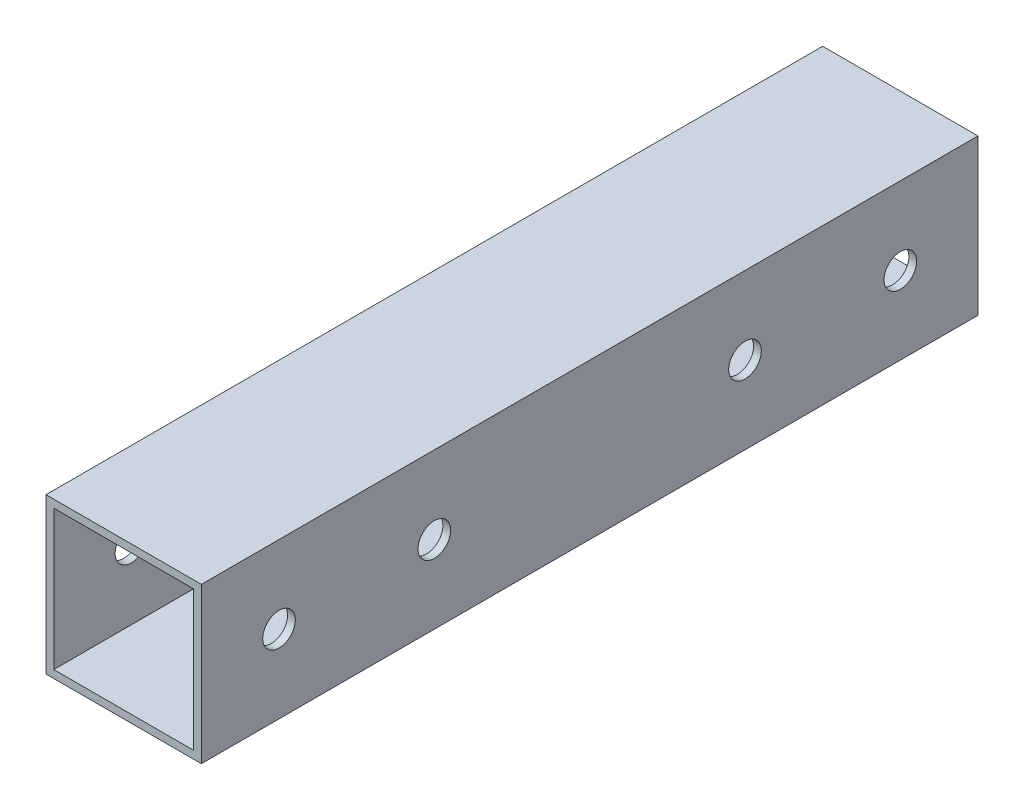
ISO-10303-21;
HEADER;
FILE_DESCRIPTION(('STEP AP214'),'2;1');
FILE_NAME('part.step','',(''),(''),'','','');
FILE_SCHEMA(('AUTOMOTIVE_DESIGN { 1 0 10303 214 1 1 1 1 }'));
ENDSEC;
DATA;
#1=APPLICATION_CONTEXT('core data for automotive mechanical design processes');
#2=APPLICATION_PROTOCOL_DEFINITION('international standard','automotive_design',2000,#1);
#3=PRODUCT_CONTEXT('',#1,'mechanical');
#4=PRODUCT('Part','Part','',(#3));
#5=PRODUCT_RELATED_PRODUCT_CATEGORY('part','',(#4));
#6=PRODUCT_DEFINITION_FORMATION('','',#4);
#7=PRODUCT_DEFINITION_CONTEXT('part definition',#1,'design');
#8=PRODUCT_DEFINITION('design','',#6,#7);
#9=PRODUCT_DEFINITION_SHAPE('','',#8);
#10=(LENGTH_UNIT() NAMED_UNIT(*) SI_UNIT(.MILLI.,.METRE.));
#11=(NAMED_UNIT(*) PLANE_ANGLE_UNIT() SI_UNIT($,.RADIAN.));
#12=(NAMED_UNIT(*) SI_UNIT($,.STERADIAN.) SOLID_ANGLE_UNIT());
#13=UNCERTAINTY_MEASURE_WITH_UNIT(LENGTH_MEASURE(1.E-05),#10,'distance_accuracy_value','');
#14=(GEOMETRIC_REPRESENTATION_CONTEXT(3) GLOBAL_UNCERTAINTY_ASSIGNED_CONTEXT((#13)) GLOBAL_UNIT_ASSIGNED_CONTEXT((#10,
#11,#12)) REPRESENTATION_CONTEXT('',''));
#15=CARTESIAN_POINT('',(0.,0.,0.));
#16=DIRECTION('',(0.,0.,1.));
#17=DIRECTION('',(1.,0.,0.));
#18=AXIS2_PLACEMENT_3D('',#15,#16,#17);
#19=CARTESIAN_POINT('',(-10.,0.,90.));
#20=DIRECTION('',(1.,0.,0.));
#21=DIRECTION('',(0.,0.,-1.));
#22=AXIS2_PLACEMENT_3D('',#19,#20,#21);
#23=CYLINDRICAL_SURFACE('',#22,2.09999999999999);
#24=CARTESIAN_POINT('',(-9.,0.,90.));
#25=DIRECTION('',(-1.,0.,0.));
#26=DIRECTION('',(0.,-1.,0.));
#27=AXIS2_PLACEMENT_3D('',#24,#25,#26);
#28=CIRCLE('',#27,2.09999999999999);
#29=CARTESIAN_POINT('',(-9.,-2.09999999999999,90.));
#30=VERTEX_POINT('',#29);
#31=EDGE_CURVE('E177',#30,#30,#28,.F.);
#32=ORIENTED_EDGE('',*,*,#31,.T.);
#33=EDGE_LOOP('',(#32));
#34=FACE_BOUND('',#33,.T.);
#35=CARTESIAN_POINT('',(-10.,0.,90.));
#36=DIRECTION('',(1.,0.,0.));
#37=DIRECTION('',(0.,0.,1.));
#38=AXIS2_PLACEMENT_3D('',#35,#36,#37);
#39=CIRCLE('',#38,2.09999999999999);
#40=CARTESIAN_POINT('',(-10.,0.,92.1));
#41=VERTEX_POINT('',#40);
#42=EDGE_CURVE('E191',#41,#41,#39,.T.);
#43=ORIENTED_EDGE('',*,*,#42,.F.);
#44=EDGE_LOOP('',(#43));
#45=FACE_BOUND('',#44,.T.);
#46=ADVANCED_FACE('F39',(#34,#45),#23,.F.);
#47=CARTESIAN_POINT('',(-10.,-1.30985636173841E-13,30.));
#48=DIRECTION('',(1.,0.,0.));
#49=DIRECTION('',(0.,0.,-1.));
#50=AXIS2_PLACEMENT_3D('',#47,#48,#49);
#51=CYLINDRICAL_SURFACE('',#50,2.1);
#52=CARTESIAN_POINT('',(-9.,-1.30985636173841E-13,30.));
#53=DIRECTION('',(-1.,0.,0.));
#54=DIRECTION('',(0.,-1.,0.));
#55=AXIS2_PLACEMENT_3D('',#52,#53,#54);
#56=CIRCLE('',#55,2.1);
#57=CARTESIAN_POINT('',(-9.,-2.10000000000013,30.));
#58=VERTEX_POINT('',#57);
#59=EDGE_CURVE('E173',#58,#58,#56,.F.);
#60=ORIENTED_EDGE('',*,*,#59,.T.);
#61=EDGE_LOOP('',(#60));
#62=FACE_BOUND('',#61,.T.);
#63=CARTESIAN_POINT('',(-10.,-1.30985636173841E-13,30.));
#64=DIRECTION('',(1.,0.,0.));
#65=DIRECTION('',(0.,0.,-1.));
#66=AXIS2_PLACEMENT_3D('',#63,#64,#65);
#67=CIRCLE('',#66,2.1);
#68=CARTESIAN_POINT('',(-10.,-1.30985636173841E-13,27.9));
#69=VERTEX_POINT('',#68);
#70=EDGE_CURVE('E207',#69,#69,#67,.T.);
#71=ORIENTED_EDGE('',*,*,#70,.F.);
#72=EDGE_LOOP('',(#71));
#73=FACE_BOUND('',#72,.T.);
#74=ADVANCED_FACE('F307',(#62,#73),#51,.F.);
#75=CARTESIAN_POINT('',(-10.,-1.39353670322384E-13,70.));
#76=DIRECTION('',(1.,0.,0.));
#77=DIRECTION('',(0.,0.,-1.));
#78=AXIS2_PLACEMENT_3D('',#75,#76,#77);
#79=CYLINDRICAL_SURFACE('',#78,2.09999999999999);
#80=CARTESIAN_POINT('',(-9.,-1.39353670322384E-13,70.));
#81=DIRECTION('',(-1.,0.,0.));
#82=DIRECTION('',(0.,-1.,0.));
#83=AXIS2_PLACEMENT_3D('',#80,#81,#82);
#84=CIRCLE('',#83,2.09999999999999);
#85=CARTESIAN_POINT('',(-9.,-2.10000000000013,70.));
#86=VERTEX_POINT('',#85);
#87=EDGE_CURVE('E169',#86,#86,#84,.F.);
#88=ORIENTED_EDGE('',*,*,#87,.T.);
#89=EDGE_LOOP('',(#88));
#90=FACE_BOUND('',#89,.T.);
#91=CARTESIAN_POINT('',(-10.,-1.39353670322384E-13,70.));
#92=DIRECTION('',(1.,0.,0.));
#93=DIRECTION('',(0.,0.,1.));
#94=AXIS2_PLACEMENT_3D('',#91,#92,#93);
#95=CIRCLE('',#94,2.09999999999999);
#96=CARTESIAN_POINT('',(-10.,-1.39353670322384E-13,72.1));
#97=VERTEX_POINT('',#96);
#98=EDGE_CURVE('E192',#97,#97,#95,.T.);
#99=ORIENTED_EDGE('',*,*,#98,.F.);
#100=EDGE_LOOP('',(#99));
#101=FACE_BOUND('',#100,.T.);
#102=ADVANCED_FACE('F312',(#90,#101),#79,.F.);
#103=CARTESIAN_POINT('',(-10.,0.,10.));
#104=DIRECTION('',(1.,0.,0.));
#105=DIRECTION('',(0.,0.,-1.));
#106=AXIS2_PLACEMENT_3D('',#103,#104,#105);
#107=CYLINDRICAL_SURFACE('',#106,2.1);
#108=CARTESIAN_POINT('',(-9.,0.,10.));
#109=DIRECTION('',(-1.,0.,0.));
#110=DIRECTION('',(0.,-1.,0.));
#111=AXIS2_PLACEMENT_3D('',#108,#109,#110);
#112=CIRCLE('',#111,2.1);
#113=CARTESIAN_POINT('',(-9.,-2.09999999999999,10.));
#114=VERTEX_POINT('',#113);
#115=EDGE_CURVE('E43',#114,#114,#112,.F.);
#116=ORIENTED_EDGE('',*,*,#115,.T.);
#117=EDGE_LOOP('',(#116));
#118=FACE_BOUND('',#117,.T.);
#119=CARTESIAN_POINT('',(-10.,0.,10.));
#120=DIRECTION('',(1.,0.,0.));
#121=DIRECTION('',(0.,0.,-1.));
#122=AXIS2_PLACEMENT_3D('',#119,#120,#121);
#123=CIRCLE('',#122,2.1);
#124=CARTESIAN_POINT('',(-10.,0.,7.9));
#125=VERTEX_POINT('',#124);
#126=EDGE_CURVE('E182',#125,#125,#123,.T.);
#127=ORIENTED_EDGE('',*,*,#126,.F.);
#128=EDGE_LOOP('',(#127));
#129=FACE_BOUND('',#128,.T.);
#130=ADVANCED_FACE('F279',(#118,#129),#107,.F.);
#131=CARTESIAN_POINT('',(10.,10.,100.));
#132=DIRECTION('',(-1.,0.,0.));
#133=DIRECTION('',(0.,0.,1.));
#134=AXIS2_PLACEMENT_3D('',#131,#132,#133);
#135=PLANE('',#134);
#136=CARTESIAN_POINT('',(10.,0.,10.));
#137=DIRECTION('',(1.,0.,0.));
#138=DIRECTION('',(0.,0.,-1.));
#139=AXIS2_PLACEMENT_3D('',#136,#137,#138);
#140=CIRCLE('',#139,2.1);
#141=CARTESIAN_POINT('',(10.,0.,7.9));
#142=VERTEX_POINT('',#141);
#143=EDGE_CURVE('E187',#142,#142,#140,.T.);
#144=ORIENTED_EDGE('',*,*,#143,.F.);
#145=EDGE_LOOP('',(#144));
#146=FACE_BOUND('',#145,.T.);
#147=CARTESIAN_POINT('',(10.,-1.39353670322384E-13,70.));
#148=DIRECTION('',(1.,0.,0.));
#149=DIRECTION('',(0.,0.,1.));
#150=AXIS2_PLACEMENT_3D('',#147,#148,#149);
#151=CIRCLE('',#150,2.09999999999999);
#152=CARTESIAN_POINT('',(10.,-1.39353670322384E-13,72.1));
#153=VERTEX_POINT('',#152);
#154=EDGE_CURVE('E181',#153,#153,#151,.T.);
#155=ORIENTED_EDGE('',*,*,#154,.F.);
#156=EDGE_LOOP('',(#155));
#157=FACE_BOUND('',#156,.T.);
#158=CARTESIAN_POINT('',(10.,-1.30985636173841E-13,30.));
#159=DIRECTION('',(1.,0.,0.));
#160=DIRECTION('',(0.,0.,-1.));
#161=AXIS2_PLACEMENT_3D('',#158,#159,#160);
#162=CIRCLE('',#161,2.1);
#163=CARTESIAN_POINT('',(10.,-1.30985636173841E-13,27.9));
#164=VERTEX_POINT('',#163);
#165=EDGE_CURVE('E196',#164,#164,#162,.T.);
#166=ORIENTED_EDGE('',*,*,#165,.F.);
#167=EDGE_LOOP('',(#166));
#168=FACE_BOUND('',#167,.T.);
#169=CARTESIAN_POINT('',(10.,0.,90.));
#170=DIRECTION('',(1.,0.,0.));
#171=DIRECTION('',(0.,0.,1.));
#172=AXIS2_PLACEMENT_3D('',#169,#170,#171);
#173=CIRCLE('',#172,2.09999999999999);
#174=CARTESIAN_POINT('',(10.,0.,92.1));
#175=VERTEX_POINT('',#174);
#176=EDGE_CURVE('E203',#175,#175,#173,.T.);
#177=ORIENTED_EDGE('',*,*,#176,.F.);
#178=EDGE_LOOP('',(#177));
#179=FACE_BOUND('',#178,.T.);
#180=DIRECTION('',(0.,1.,0.));
#181=VECTOR('',#180,1.);
#182=CARTESIAN_POINT('',(10.,10.,0.));
#183=LINE('',#182,#181);
#184=CARTESIAN_POINT('',(10.,-10.,0.));
#185=VERTEX_POINT('',#184);
#186=CARTESIAN_POINT('',(10.,10.,0.));
#187=VERTEX_POINT('',#186);
#188=EDGE_CURVE('E186',#185,#187,#183,.T.);
#189=ORIENTED_EDGE('',*,*,#188,.T.);
#190=DIRECTION('',(0.,0.,-1.));
#191=VECTOR('',#190,1.);
#192=CARTESIAN_POINT('',(10.,10.,100.));
#193=LINE('',#192,#191);
#194=CARTESIAN_POINT('',(10.,10.,100.));
#195=VERTEX_POINT('',#194);
#196=EDGE_CURVE('E11',#195,#187,#193,.T.);
#197=ORIENTED_EDGE('',*,*,#196,.F.);
#198=DIRECTION('',(0.,1.,0.));
#199=VECTOR('',#198,1.);
#200=CARTESIAN_POINT('',(10.,10.,100.));
#201=LINE('',#200,#199);
#202=CARTESIAN_POINT('',(10.,-10.,100.));
#203=VERTEX_POINT('',#202);
#204=EDGE_CURVE('E214',#203,#195,#201,.T.);
#205=ORIENTED_EDGE('',*,*,#204,.F.);
#206=DIRECTION('',(0.,0.,-1.));
#207=VECTOR('',#206,1.);
#208=CARTESIAN_POINT('',(10.,-10.,100.));
#209=LINE('',#208,#207);
#210=EDGE_CURVE('E228',#203,#185,#209,.T.);
#211=ORIENTED_EDGE('',*,*,#210,.T.);
#212=EDGE_LOOP('',(#189,#197,#205,#211));
#213=FACE_BOUND('',#212,.T.);
#214=ADVANCED_FACE('F41',(#146,#157,#168,#179,#213),#135,.F.);
#215=CARTESIAN_POINT('',(-10.,10.,100.));
#216=DIRECTION('',(0.,-1.,0.));
#217=DIRECTION('',(0.,0.,-1.));
#218=AXIS2_PLACEMENT_3D('',#215,#216,#217);
#219=PLANE('',#218);
#220=DIRECTION('',(-1.,0.,0.));
#221=VECTOR('',#220,1.);
#222=CARTESIAN_POINT('',(-10.,10.,0.));
#223=LINE('',#222,#221);
#224=CARTESIAN_POINT('',(-10.,10.,0.));
#225=VERTEX_POINT('',#224);
#226=EDGE_CURVE('E232',#187,#225,#223,.T.);
#227=ORIENTED_EDGE('',*,*,#226,.T.);
#228=DIRECTION('',(0.,0.,-1.));
#229=VECTOR('',#228,1.);
#230=CARTESIAN_POINT('',(-10.,10.,100.));
#231=LINE('',#230,#229);
#232=CARTESIAN_POINT('',(-10.,10.,100.));
#233=VERTEX_POINT('',#232);
#234=EDGE_CURVE('E49',#233,#225,#231,.T.);
#235=ORIENTED_EDGE('',*,*,#234,.F.);
#236=DIRECTION('',(-1.,0.,0.));
#237=VECTOR('',#236,1.);
#238=CARTESIAN_POINT('',(-10.,10.,100.));
#239=LINE('',#238,#237);
#240=EDGE_CURVE('E218',#195,#233,#239,.T.);
#241=ORIENTED_EDGE('',*,*,#240,.F.);
#242=ORIENTED_EDGE('',*,*,#196,.T.);
#243=EDGE_LOOP('',(#227,#235,#241,#242));
#244=FACE_BOUND('',#243,.T.);
#245=ADVANCED_FACE('F278',(#244),#219,.F.);
#246=CARTESIAN_POINT('',(-10.,10.,100.));
#247=DIRECTION('',(1.,0.,0.));
#248=DIRECTION('',(0.,1.,0.));
#249=AXIS2_PLACEMENT_3D('',#246,#247,#248);
#250=PLANE('',#249);
#251=ORIENTED_EDGE('',*,*,#126,.T.);
#252=EDGE_LOOP('',(#251));
#253=FACE_BOUND('',#252,.T.);
#254=ORIENTED_EDGE('',*,*,#98,.T.);
#255=EDGE_LOOP('',(#254));
#256=FACE_BOUND('',#255,.T.);
#257=ORIENTED_EDGE('',*,*,#70,.T.);
#258=EDGE_LOOP('',(#257));
#259=FACE_BOUND('',#258,.T.);
#260=ORIENTED_EDGE('',*,*,#42,.T.);
#261=EDGE_LOOP('',(#260));
#262=FACE_BOUND('',#261,.T.);
#263=DIRECTION('',(0.,-1.,0.));
#264=VECTOR('',#263,1.);
#265=CARTESIAN_POINT('',(-10.,10.,0.));
#266=LINE('',#265,#264);
#267=CARTESIAN_POINT('',(-10.,-10.,0.));
#268=VERTEX_POINT('',#267);
#269=EDGE_CURVE('E235',#225,#268,#266,.T.);
#270=ORIENTED_EDGE('',*,*,#269,.T.);
#271=DIRECTION('',(0.,0.,-1.));
#272=VECTOR('',#271,1.);
#273=CARTESIAN_POINT('',(-10.,-10.,100.));
#274=LINE('',#273,#272);
#275=CARTESIAN_POINT('',(-10.,-10.,100.));
#276=VERTEX_POINT('',#275);
#277=EDGE_CURVE('E243',#276,#268,#274,.T.);
#278=ORIENTED_EDGE('',*,*,#277,.F.);
#279=DIRECTION('',(0.,-1.,0.));
#280=VECTOR('',#279,1.);
#281=CARTESIAN_POINT('',(-10.,10.,100.));
#282=LINE('',#281,#280);
#283=EDGE_CURVE('E222',#233,#276,#282,.T.);
#284=ORIENTED_EDGE('',*,*,#283,.F.);
#285=ORIENTED_EDGE('',*,*,#234,.T.);
#286=EDGE_LOOP('',(#270,#278,#284,#285));
#287=FACE_BOUND('',#286,.T.);
#288=ADVANCED_FACE('F296',(#253,#256,#259,#262,#287),#250,.F.);
#289=CARTESIAN_POINT('',(-10.,-10.,100.));
#290=DIRECTION('',(0.,1.,0.));
#291=DIRECTION('',(0.,0.,1.));
#292=AXIS2_PLACEMENT_3D('',#289,#290,#291);
#293=PLANE('',#292);
#294=DIRECTION('',(1.,0.,0.));
#295=VECTOR('',#294,1.);
#296=CARTESIAN_POINT('',(-10.,-10.,0.));
#297=LINE('',#296,#295);
#298=EDGE_CURVE('E219',#268,#185,#297,.T.);
#299=ORIENTED_EDGE('',*,*,#298,.T.);
#300=ORIENTED_EDGE('',*,*,#210,.F.);
#301=DIRECTION('',(1.,0.,0.));
#302=VECTOR('',#301,1.);
#303=CARTESIAN_POINT('',(-10.,-10.,100.));
#304=LINE('',#303,#302);
#305=EDGE_CURVE('E225',#276,#203,#304,.T.);
#306=ORIENTED_EDGE('',*,*,#305,.F.);
#307=ORIENTED_EDGE('',*,*,#277,.T.);
#308=EDGE_LOOP('',(#299,#300,#306,#307));
#309=FACE_BOUND('',#308,.T.);
#310=ADVANCED_FACE('F294',(#309),#293,.F.);
#311=CARTESIAN_POINT('',(0.,0.,100.));
#312=DIRECTION('',(0.,0.,1.));
#313=DIRECTION('',(1.,0.,0.));
#314=AXIS2_PLACEMENT_3D('',#311,#312,#313);
#315=PLANE('',#314);
#316=DIRECTION('',(0.,1.,0.));
#317=VECTOR('',#316,1.);
#318=CARTESIAN_POINT('',(-9.,9.,100.));
#319=LINE('',#318,#317);
#320=CARTESIAN_POINT('',(-9.,-9.,100.));
#321=VERTEX_POINT('',#320);
#322=CARTESIAN_POINT('',(-9.,9.,100.));
#323=VERTEX_POINT('',#322);
#324=EDGE_CURVE('E110',#321,#323,#319,.T.);
#325=ORIENTED_EDGE('',*,*,#324,.T.);
#326=DIRECTION('',(1.,0.,0.));
#327=VECTOR('',#326,1.);
#328=CARTESIAN_POINT('',(9.,9.,100.));
#329=LINE('',#328,#327);
#330=CARTESIAN_POINT('',(9.,9.,100.));
#331=VERTEX_POINT('',#330);
#332=EDGE_CURVE('E120',#323,#331,#329,.T.);
#333=ORIENTED_EDGE('',*,*,#332,.T.);
#334=DIRECTION('',(0.,-1.,0.));
#335=VECTOR('',#334,1.);
#336=CARTESIAN_POINT('',(9.,9.,100.));
#337=LINE('',#336,#335);
#338=CARTESIAN_POINT('',(9.,-9.,100.));
#339=VERTEX_POINT('',#338);
#340=EDGE_CURVE('E57',#331,#339,#337,.T.);
#341=ORIENTED_EDGE('',*,*,#340,.T.);
#342=DIRECTION('',(-1.,0.,0.));
#343=VECTOR('',#342,1.);
#344=CARTESIAN_POINT('',(9.,-9.,100.));
#345=LINE('',#344,#343);
#346=EDGE_CURVE('E117',#339,#321,#345,.T.);
#347=ORIENTED_EDGE('',*,*,#346,.T.);
#348=EDGE_LOOP('',(#325,#333,#341,#347));
#349=FACE_BOUND('',#348,.T.);
#350=ORIENTED_EDGE('',*,*,#204,.T.);
#351=ORIENTED_EDGE('',*,*,#240,.T.);
#352=ORIENTED_EDGE('',*,*,#283,.T.);
#353=ORIENTED_EDGE('',*,*,#305,.T.);
#354=EDGE_LOOP('',(#350,#351,#352,#353));
#355=FACE_BOUND('',#354,.T.);
#356=ADVANCED_FACE('F125',(#349,#355),#315,.T.);
#357=CARTESIAN_POINT('',(0.,0.,0.));
#358=DIRECTION('',(0.,0.,1.));
#359=DIRECTION('',(1.,0.,0.));
#360=AXIS2_PLACEMENT_3D('',#357,#358,#359);
#361=PLANE('',#360);
#362=DIRECTION('',(1.,0.,0.));
#363=VECTOR('',#362,1.);
#364=CARTESIAN_POINT('',(9.,9.,0.));
#365=LINE('',#364,#363);
#366=CARTESIAN_POINT('',(-9.,9.,0.));
#367=VERTEX_POINT('',#366);
#368=CARTESIAN_POINT('',(9.,9.,0.));
#369=VERTEX_POINT('',#368);
#370=EDGE_CURVE('E142',#367,#369,#365,.T.);
#371=ORIENTED_EDGE('',*,*,#370,.F.);
#372=DIRECTION('',(0.,1.,0.));
#373=VECTOR('',#372,1.);
#374=CARTESIAN_POINT('',(-9.,9.,0.));
#375=LINE('',#374,#373);
#376=CARTESIAN_POINT('',(-9.,-9.,0.));
#377=VERTEX_POINT('',#376);
#378=EDGE_CURVE('E65',#377,#367,#375,.T.);
#379=ORIENTED_EDGE('',*,*,#378,.F.);
#380=DIRECTION('',(-1.,0.,0.));
#381=VECTOR('',#380,1.);
#382=CARTESIAN_POINT('',(9.,-9.,0.));
#383=LINE('',#382,#381);
#384=CARTESIAN_POINT('',(9.,-9.,0.));
#385=VERTEX_POINT('',#384);
#386=EDGE_CURVE('E129',#385,#377,#383,.T.);
#387=ORIENTED_EDGE('',*,*,#386,.F.);
#388=DIRECTION('',(0.,-1.,0.));
#389=VECTOR('',#388,1.);
#390=CARTESIAN_POINT('',(9.,9.,0.));
#391=LINE('',#390,#389);
#392=EDGE_CURVE('E133',#369,#385,#391,.T.);
#393=ORIENTED_EDGE('',*,*,#392,.F.);
#394=EDGE_LOOP('',(#371,#379,#387,#393));
#395=FACE_BOUND('',#394,.T.);
#396=ORIENTED_EDGE('',*,*,#188,.F.);
#397=ORIENTED_EDGE('',*,*,#298,.F.);
#398=ORIENTED_EDGE('',*,*,#269,.F.);
#399=ORIENTED_EDGE('',*,*,#226,.F.);
#400=EDGE_LOOP('',(#396,#397,#398,#399));
#401=FACE_BOUND('',#400,.T.);
#402=ADVANCED_FACE('F272',(#395,#401),#361,.F.);
#403=CARTESIAN_POINT('',(9.,0.,90.));
#404=DIRECTION('',(1.,0.,0.));
#405=DIRECTION('',(0.,1.,0.));
#406=AXIS2_PLACEMENT_3D('',#403,#404,#405);
#407=CIRCLE('',#406,2.09999999999999);
#408=CARTESIAN_POINT('',(9.,2.09999999999998,90.));
#409=VERTEX_POINT('',#408);
#410=EDGE_CURVE('E165',#409,#409,#407,.F.);
#411=ORIENTED_EDGE('',*,*,#410,.T.);
#412=EDGE_LOOP('',(#411));
#413=FACE_BOUND('',#412,.T.);
#414=ORIENTED_EDGE('',*,*,#176,.T.);
#415=EDGE_LOOP('',(#414));
#416=FACE_BOUND('',#415,.T.);
#417=ADVANCED_FACE('F268',(#413,#416),#23,.F.);
#418=CARTESIAN_POINT('',(9.,-1.30985636173841E-13,30.));
#419=DIRECTION('',(1.,0.,0.));
#420=DIRECTION('',(0.,1.,0.));
#421=AXIS2_PLACEMENT_3D('',#418,#419,#420);
#422=CIRCLE('',#421,2.1);
#423=CARTESIAN_POINT('',(9.,2.09999999999987,30.));
#424=VERTEX_POINT('',#423);
#425=EDGE_CURVE('E161',#424,#424,#422,.F.);
#426=ORIENTED_EDGE('',*,*,#425,.T.);
#427=EDGE_LOOP('',(#426));
#428=FACE_BOUND('',#427,.T.);
#429=ORIENTED_EDGE('',*,*,#165,.T.);
#430=EDGE_LOOP('',(#429));
#431=FACE_BOUND('',#430,.T.);
#432=ADVANCED_FACE('F271',(#428,#431),#51,.F.);
#433=CARTESIAN_POINT('',(9.,-1.39353670322384E-13,70.));
#434=DIRECTION('',(1.,0.,0.));
#435=DIRECTION('',(0.,1.,0.));
#436=AXIS2_PLACEMENT_3D('',#433,#434,#435);
#437=CIRCLE('',#436,2.09999999999999);
#438=CARTESIAN_POINT('',(9.,2.09999999999985,70.));
#439=VERTEX_POINT('',#438);
#440=EDGE_CURVE('E157',#439,#439,#437,.F.);
#441=ORIENTED_EDGE('',*,*,#440,.T.);
#442=EDGE_LOOP('',(#441));
#443=FACE_BOUND('',#442,.T.);
#444=ORIENTED_EDGE('',*,*,#154,.T.);
#445=EDGE_LOOP('',(#444));
#446=FACE_BOUND('',#445,.T.);
#447=ADVANCED_FACE('F317',(#443,#446),#79,.F.);
#448=CARTESIAN_POINT('',(9.,0.,10.));
#449=DIRECTION('',(1.,0.,0.));
#450=DIRECTION('',(0.,1.,0.));
#451=AXIS2_PLACEMENT_3D('',#448,#449,#450);
#452=CIRCLE('',#451,2.1);
#453=CARTESIAN_POINT('',(9.,2.10000000000001,10.));
#454=VERTEX_POINT('',#453);
#455=EDGE_CURVE('E151',#454,#454,#452,.F.);
#456=ORIENTED_EDGE('',*,*,#455,.T.);
#457=EDGE_LOOP('',(#456));
#458=FACE_BOUND('',#457,.T.);
#459=ORIENTED_EDGE('',*,*,#143,.T.);
#460=EDGE_LOOP('',(#459));
#461=FACE_BOUND('',#460,.T.);
#462=ADVANCED_FACE('F253',(#458,#461),#107,.F.);
#463=CARTESIAN_POINT('',(-9.,9.,100.));
#464=DIRECTION('',(-1.,0.,0.));
#465=DIRECTION('',(0.,-1.,0.));
#466=AXIS2_PLACEMENT_3D('',#463,#464,#465);
#467=PLANE('',#466);
#468=ORIENTED_EDGE('',*,*,#59,.F.);
#469=EDGE_LOOP('',(#468));
#470=FACE_BOUND('',#469,.T.);
#471=ORIENTED_EDGE('',*,*,#115,.F.);
#472=EDGE_LOOP('',(#471));
#473=FACE_BOUND('',#472,.T.);
#474=ORIENTED_EDGE('',*,*,#378,.T.);
#475=DIRECTION('',(0.,0.,-1.));
#476=VECTOR('',#475,1.);
#477=CARTESIAN_POINT('',(-9.,9.,100.));
#478=LINE('',#477,#476);
#479=EDGE_CURVE('E105',#323,#367,#478,.T.);
#480=ORIENTED_EDGE('',*,*,#479,.F.);
#481=ORIENTED_EDGE('',*,*,#324,.F.);
#482=DIRECTION('',(0.,0.,-1.));
#483=VECTOR('',#482,1.);
#484=CARTESIAN_POINT('',(-9.,-9.,100.));
#485=LINE('',#484,#483);
#486=EDGE_CURVE('E148',#321,#377,#485,.T.);
#487=ORIENTED_EDGE('',*,*,#486,.T.);
#488=EDGE_LOOP('',(#474,#480,#481,#487));
#489=FACE_BOUND('',#488,.T.);
#490=ORIENTED_EDGE('',*,*,#87,.F.);
#491=EDGE_LOOP('',(#490));
#492=FACE_BOUND('',#491,.T.);
#493=ORIENTED_EDGE('',*,*,#31,.F.);
#494=EDGE_LOOP('',(#493));
#495=FACE_BOUND('',#494,.T.);
#496=ADVANCED_FACE('F107',(#470,#473,#489,#492,#495),#467,.F.);
#497=CARTESIAN_POINT('',(9.,9.,100.));
#498=DIRECTION('',(1.,0.,0.));
#499=DIRECTION('',(0.,1.,0.));
#500=AXIS2_PLACEMENT_3D('',#497,#498,#499);
#501=PLANE('',#500);
#502=ORIENTED_EDGE('',*,*,#425,.F.);
#503=EDGE_LOOP('',(#502));
#504=FACE_BOUND('',#503,.T.);
#505=ORIENTED_EDGE('',*,*,#455,.F.);
#506=EDGE_LOOP('',(#505));
#507=FACE_BOUND('',#506,.T.);
#508=ORIENTED_EDGE('',*,*,#392,.T.);
#509=DIRECTION('',(0.,0.,-1.));
#510=VECTOR('',#509,1.);
#511=CARTESIAN_POINT('',(9.,-9.,100.));
#512=LINE('',#511,#510);
#513=EDGE_CURVE('E152',#339,#385,#512,.T.);
#514=ORIENTED_EDGE('',*,*,#513,.F.);
#515=ORIENTED_EDGE('',*,*,#340,.F.);
#516=DIRECTION('',(0.,0.,-1.));
#517=VECTOR('',#516,1.);
#518=CARTESIAN_POINT('',(9.,9.,100.));
#519=LINE('',#518,#517);
#520=EDGE_CURVE('E116',#331,#369,#519,.T.);
#521=ORIENTED_EDGE('',*,*,#520,.T.);
#522=EDGE_LOOP('',(#508,#514,#515,#521));
#523=FACE_BOUND('',#522,.T.);
#524=ORIENTED_EDGE('',*,*,#440,.F.);
#525=EDGE_LOOP('',(#524));
#526=FACE_BOUND('',#525,.T.);
#527=ORIENTED_EDGE('',*,*,#410,.F.);
#528=EDGE_LOOP('',(#527));
#529=FACE_BOUND('',#528,.T.);
#530=ADVANCED_FACE('F256',(#504,#507,#523,#526,#529),#501,.F.);
#531=CARTESIAN_POINT('',(9.,-9.,100.));
#532=DIRECTION('',(0.,-1.,0.));
#533=DIRECTION('',(0.,0.,-1.));
#534=AXIS2_PLACEMENT_3D('',#531,#532,#533);
#535=PLANE('',#534);
#536=ORIENTED_EDGE('',*,*,#386,.T.);
#537=ORIENTED_EDGE('',*,*,#486,.F.);
#538=ORIENTED_EDGE('',*,*,#346,.F.);
#539=ORIENTED_EDGE('',*,*,#513,.T.);
#540=EDGE_LOOP('',(#536,#537,#538,#539));
#541=FACE_BOUND('',#540,.T.);
#542=ADVANCED_FACE('F258',(#541),#535,.F.);
#543=CARTESIAN_POINT('',(9.,9.,100.));
#544=DIRECTION('',(0.,1.,0.));
#545=DIRECTION('',(0.,0.,1.));
#546=AXIS2_PLACEMENT_3D('',#543,#544,#545);
#547=PLANE('',#546);
#548=ORIENTED_EDGE('',*,*,#370,.T.);
#549=ORIENTED_EDGE('',*,*,#520,.F.);
#550=ORIENTED_EDGE('',*,*,#332,.F.);
#551=ORIENTED_EDGE('',*,*,#479,.T.);
#552=EDGE_LOOP('',(#548,#549,#550,#551));
#553=FACE_BOUND('',#552,.T.);
#554=ADVANCED_FACE('F121',(#553),#547,.F.);
#555=CLOSED_SHELL('',(#46,#74,#102,#130,#214,#245,#288,#310,#356,#402,#417,#432,#447,#462,#496,
#530,#542,#554));
#556=MANIFOLD_SOLID_BREP('B2',#555);
#557=ADVANCED_BREP_SHAPE_REPRESENTATION('',(#18,#556),#14);
#558=SHAPE_DEFINITION_REPRESENTATION(#9,#557);
ENDSEC;
END-ISO-10303-21;
